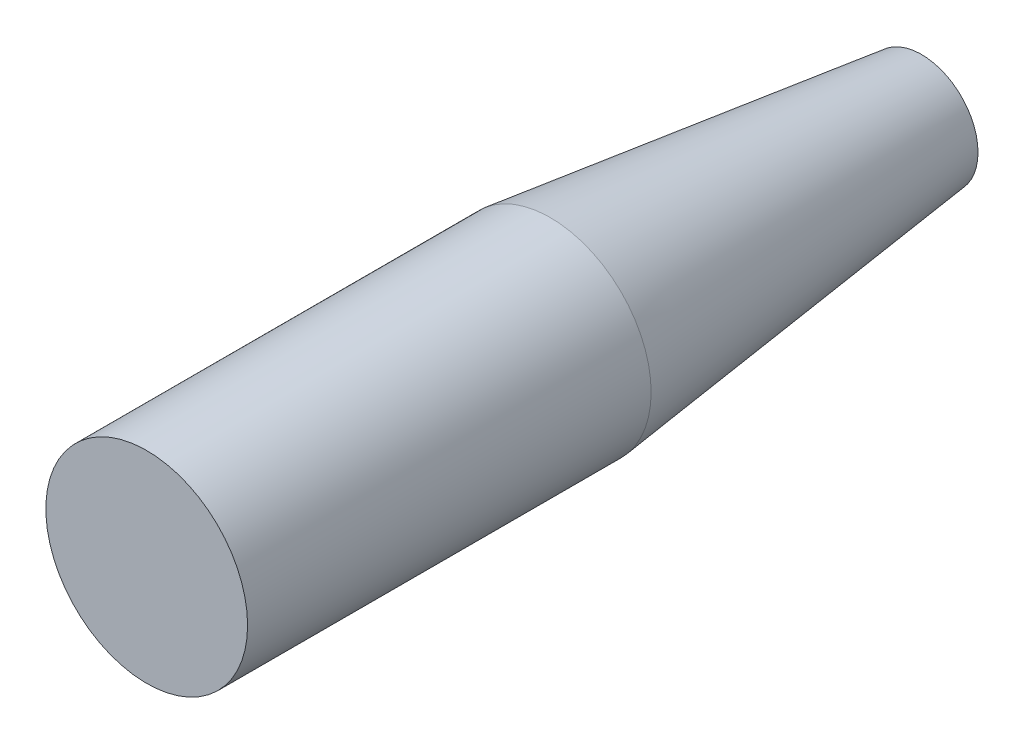
ISO-10303-21;
HEADER;
FILE_DESCRIPTION(('STEP AP214'),'2;1');
FILE_NAME('part.step','',(''),(''),'','','');
FILE_SCHEMA(('AUTOMOTIVE_DESIGN { 1 0 10303 214 1 1 1 1 }'));
ENDSEC;
DATA;
#1=APPLICATION_CONTEXT('core data for automotive mechanical design processes');
#2=APPLICATION_PROTOCOL_DEFINITION('international standard','automotive_design',2000,#1);
#3=PRODUCT_CONTEXT('',#1,'mechanical');
#4=PRODUCT('Part','Part','',(#3));
#5=PRODUCT_RELATED_PRODUCT_CATEGORY('part','',(#4));
#6=PRODUCT_DEFINITION_FORMATION('','',#4);
#7=PRODUCT_DEFINITION_CONTEXT('part definition',#1,'design');
#8=PRODUCT_DEFINITION('design','',#6,#7);
#9=PRODUCT_DEFINITION_SHAPE('','',#8);
#10=(LENGTH_UNIT() NAMED_UNIT(*) SI_UNIT(.MILLI.,.METRE.));
#11=(NAMED_UNIT(*) PLANE_ANGLE_UNIT() SI_UNIT($,.RADIAN.));
#12=(NAMED_UNIT(*) SI_UNIT($,.STERADIAN.) SOLID_ANGLE_UNIT());
#13=UNCERTAINTY_MEASURE_WITH_UNIT(LENGTH_MEASURE(1.E-05),#10,'distance_accuracy_value','');
#14=(GEOMETRIC_REPRESENTATION_CONTEXT(3) GLOBAL_UNCERTAINTY_ASSIGNED_CONTEXT((#13)) GLOBAL_UNIT_ASSIGNED_CONTEXT((#10,
#11,#12)) REPRESENTATION_CONTEXT('',''));
#15=CARTESIAN_POINT('',(0.,0.,0.));
#16=DIRECTION('',(0.,0.,1.));
#17=DIRECTION('',(1.,0.,0.));
#18=AXIS2_PLACEMENT_3D('',#15,#16,#17);
#19=CARTESIAN_POINT('',(0.,0.,25.));
#20=DIRECTION('',(0.,0.,-1.));
#21=DIRECTION('',(-1.,0.,0.));
#22=AXIS2_PLACEMENT_3D('',#19,#20,#21);
#23=CYLINDRICAL_SURFACE('',#22,6.25);
#24=CARTESIAN_POINT('',(0.,0.,25.));
#25=DIRECTION('',(0.,0.,1.));
#26=DIRECTION('',(1.,0.,0.));
#27=AXIS2_PLACEMENT_3D('',#24,#25,#26);
#28=CIRCLE('',#27,6.25);
#29=CARTESIAN_POINT('',(6.25,0.,25.));
#30=VERTEX_POINT('',#29);
#31=EDGE_CURVE('E10',#30,#30,#28,.T.);
#32=ORIENTED_EDGE('',*,*,#31,.F.);
#33=EDGE_LOOP('',(#32));
#34=FACE_BOUND('',#33,.T.);
#35=CARTESIAN_POINT('',(0.,0.,0.));
#36=DIRECTION('',(0.,0.,1.));
#37=DIRECTION('',(1.,0.,0.));
#38=AXIS2_PLACEMENT_3D('',#35,#36,#37);
#39=CIRCLE('',#38,6.25);
#40=CARTESIAN_POINT('',(6.25,0.,0.));
#41=VERTEX_POINT('',#40);
#42=EDGE_CURVE('E37',#41,#41,#39,.T.);
#43=ORIENTED_EDGE('',*,*,#42,.T.);
#44=EDGE_LOOP('',(#43));
#45=FACE_BOUND('',#44,.T.);
#46=ADVANCED_FACE('F31',(#34,#45),#23,.T.);
#47=CARTESIAN_POINT('',(0.,0.,25.));
#48=DIRECTION('',(0.,0.,1.));
#49=DIRECTION('',(1.,0.,0.));
#50=AXIS2_PLACEMENT_3D('',#47,#48,#49);
#51=PLANE('',#50);
#52=ORIENTED_EDGE('',*,*,#31,.T.);
#53=EDGE_LOOP('',(#52));
#54=FACE_BOUND('',#53,.T.);
#55=ADVANCED_FACE('F66',(#54),#51,.T.);
#56=CARTESIAN_POINT('',(0.,0.,0.));
#57=DIRECTION('',(0.,0.,1.));
#58=DIRECTION('',(1.,0.,0.));
#59=AXIS2_PLACEMENT_3D('',#56,#57,#58);
#60=CONICAL_SURFACE('',#59,6.25,0.11900029338278);
#61=CARTESIAN_POINT('',(0.,0.,-23.));
#62=DIRECTION('',(0.,0.,1.));
#63=DIRECTION('',(1.,0.,0.));
#64=AXIS2_PLACEMENT_3D('',#61,#62,#63);
#65=CIRCLE('',#64,3.5);
#66=CARTESIAN_POINT('',(3.5,0.,-23.));
#67=VERTEX_POINT('',#66);
#68=EDGE_CURVE('E41',#67,#67,#65,.T.);
#69=ORIENTED_EDGE('',*,*,#68,.T.);
#70=EDGE_LOOP('',(#69));
#71=FACE_BOUND('',#70,.T.);
#72=ORIENTED_EDGE('',*,*,#42,.F.);
#73=EDGE_LOOP('',(#72));
#74=FACE_BOUND('',#73,.T.);
#75=ADVANCED_FACE('F71',(#71,#74),#60,.T.);
#76=CARTESIAN_POINT('',(3.5,0.,-23.));
#77=DIRECTION('',(0.,0.,-1.));
#78=DIRECTION('',(-1.,0.,0.));
#79=AXIS2_PLACEMENT_3D('',#76,#77,#78);
#80=PLANE('',#79);
#81=CARTESIAN_POINT('',(0.,0.,-23.));
#82=DIRECTION('',(0.,0.,1.));
#83=DIRECTION('',(1.,0.,0.));
#84=AXIS2_PLACEMENT_3D('',#81,#82,#83);
#85=CIRCLE('',#84,2.5);
#86=CARTESIAN_POINT('',(2.5,0.,-23.));
#87=VERTEX_POINT('',#86);
#88=EDGE_CURVE('E45',#87,#87,#85,.T.);
#89=ORIENTED_EDGE('',*,*,#88,.T.);
#90=EDGE_LOOP('',(#89));
#91=FACE_BOUND('',#90,.T.);
#92=ORIENTED_EDGE('',*,*,#68,.F.);
#93=EDGE_LOOP('',(#92));
#94=FACE_BOUND('',#93,.T.);
#95=ADVANCED_FACE('F63',(#91,#94),#80,.T.);
#96=CARTESIAN_POINT('',(0.,0.,25.));
#97=DIRECTION('',(0.,0.,1.));
#98=DIRECTION('',(1.,0.,0.));
#99=AXIS2_PLACEMENT_3D('',#96,#97,#98);
#100=CYLINDRICAL_SURFACE('',#99,2.5);
#101=CARTESIAN_POINT('',(0.,0.,-21.));
#102=DIRECTION('',(0.,0.,1.));
#103=DIRECTION('',(1.,0.,0.));
#104=AXIS2_PLACEMENT_3D('',#101,#102,#103);
#105=CIRCLE('',#104,2.5);
#106=CARTESIAN_POINT('',(2.5,0.,-21.));
#107=VERTEX_POINT('',#106);
#108=EDGE_CURVE('E50',#107,#107,#105,.T.);
#109=ORIENTED_EDGE('',*,*,#108,.T.);
#110=EDGE_LOOP('',(#109));
#111=FACE_BOUND('',#110,.T.);
#112=ORIENTED_EDGE('',*,*,#88,.F.);
#113=EDGE_LOOP('',(#112));
#114=FACE_BOUND('',#113,.T.);
#115=ADVANCED_FACE('F54',(#111,#114),#100,.F.);
#116=CARTESIAN_POINT('',(0.,0.,-21.));
#117=DIRECTION('',(0.,0.,-1.));
#118=DIRECTION('',(-1.,0.,0.));
#119=AXIS2_PLACEMENT_3D('',#116,#117,#118);
#120=PLANE('',#119);
#121=ORIENTED_EDGE('',*,*,#108,.F.);
#122=EDGE_LOOP('',(#121));
#123=FACE_BOUND('',#122,.T.);
#124=ADVANCED_FACE('F57',(#123),#120,.T.);
#125=CLOSED_SHELL('',(#46,#55,#75,#95,#115,#124));
#126=MANIFOLD_SOLID_BREP('B2',#125);
#127=ADVANCED_BREP_SHAPE_REPRESENTATION('',(#18,#126),#14);
#128=SHAPE_DEFINITION_REPRESENTATION(#9,#127);
ENDSEC;
END-ISO-10303-21;
